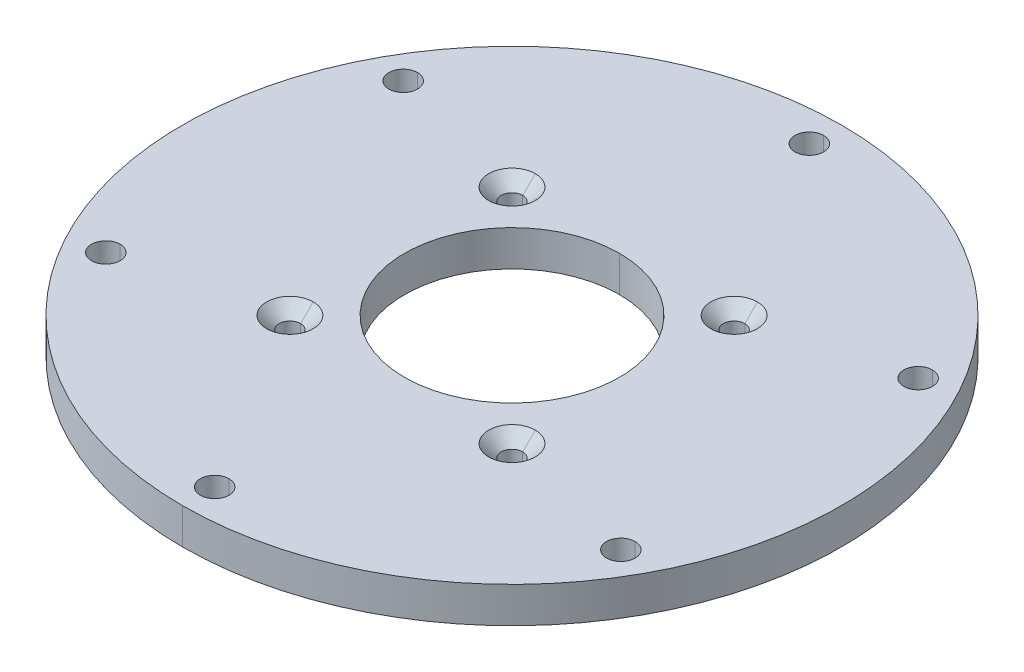
ISO-10303-21;
HEADER;
FILE_DESCRIPTION(('STEP AP214'),'2;1');
FILE_NAME('part.step','',(''),(''),'','','');
FILE_SCHEMA(('AUTOMOTIVE_DESIGN { 1 0 10303 214 1 1 1 1 }'));
ENDSEC;
DATA;
#1=APPLICATION_CONTEXT('core data for automotive mechanical design processes');
#2=APPLICATION_PROTOCOL_DEFINITION('international standard','automotive_design',2000,#1);
#3=PRODUCT_CONTEXT('',#1,'mechanical');
#4=PRODUCT('Part','Part','',(#3));
#5=PRODUCT_RELATED_PRODUCT_CATEGORY('part','',(#4));
#6=PRODUCT_DEFINITION_FORMATION('','',#4);
#7=PRODUCT_DEFINITION_CONTEXT('part definition',#1,'design');
#8=PRODUCT_DEFINITION('design','',#6,#7);
#9=PRODUCT_DEFINITION_SHAPE('','',#8);
#10=(LENGTH_UNIT() NAMED_UNIT(*) SI_UNIT(.MILLI.,.METRE.));
#11=(NAMED_UNIT(*) PLANE_ANGLE_UNIT() SI_UNIT($,.RADIAN.));
#12=(NAMED_UNIT(*) SI_UNIT($,.STERADIAN.) SOLID_ANGLE_UNIT());
#13=UNCERTAINTY_MEASURE_WITH_UNIT(LENGTH_MEASURE(1.E-05),#10,'distance_accuracy_value','');
#14=(GEOMETRIC_REPRESENTATION_CONTEXT(3) GLOBAL_UNCERTAINTY_ASSIGNED_CONTEXT((#13)) GLOBAL_UNIT_ASSIGNED_CONTEXT((#10,
#11,#12)) REPRESENTATION_CONTEXT('',''));
#15=CARTESIAN_POINT('',(0.,0.,0.));
#16=DIRECTION('',(0.,0.,1.));
#17=DIRECTION('',(1.,0.,0.));
#18=AXIS2_PLACEMENT_3D('',#15,#16,#17);
#19=CARTESIAN_POINT('',(15.5,5.,-15.5));
#20=DIRECTION('',(0.,1.,0.));
#21=DIRECTION('',(0.,0.,1.));
#22=AXIS2_PLACEMENT_3D('',#19,#20,#21);
#23=CONICAL_SURFACE('',#22,3.25,0.785398163397448);
#24=DIRECTION('',(0.,0.707106781186548,-0.707106781186548));
#25=VECTOR('',#24,1.);
#26=CARTESIAN_POINT('',(15.5,5.,-18.75));
#27=LINE('',#26,#25);
#28=CARTESIAN_POINT('',(15.5,3.25,-17.));
#29=VERTEX_POINT('',#28);
#30=CARTESIAN_POINT('',(15.5,5.,-18.75));
#31=VERTEX_POINT('',#30);
#32=EDGE_CURVE('E390',#29,#31,#27,.T.);
#33=ORIENTED_EDGE('',*,*,#32,.F.);
#34=CARTESIAN_POINT('',(15.5,3.25,-15.5));
#35=DIRECTION('',(0.,-1.,0.));
#36=DIRECTION('',(0.,0.,1.));
#37=AXIS2_PLACEMENT_3D('',#34,#35,#36);
#38=CIRCLE('',#37,1.5);
#39=CARTESIAN_POINT('',(15.5,3.25,-14.));
#40=VERTEX_POINT('',#39);
#41=EDGE_CURVE('E79',#29,#40,#38,.T.);
#42=ORIENTED_EDGE('',*,*,#41,.T.);
#43=DIRECTION('',(0.,0.707106781186548,0.707106781186548));
#44=VECTOR('',#43,1.);
#45=CARTESIAN_POINT('',(15.5,5.,-12.25));
#46=LINE('',#45,#44);
#47=CARTESIAN_POINT('',(15.5,5.,-12.25));
#48=VERTEX_POINT('',#47);
#49=EDGE_CURVE('E400',#40,#48,#46,.T.);
#50=ORIENTED_EDGE('',*,*,#49,.T.);
#51=CARTESIAN_POINT('',(15.5,5.,-15.5));
#52=DIRECTION('',(0.,1.,0.));
#53=DIRECTION('',(0.,0.,1.));
#54=AXIS2_PLACEMENT_3D('',#51,#52,#53);
#55=CIRCLE('',#54,3.25);
#56=EDGE_CURVE('E134',#48,#31,#55,.T.);
#57=ORIENTED_EDGE('',*,*,#56,.T.);
#58=EDGE_LOOP('',(#33,#42,#50,#57));
#59=FACE_BOUND('',#58,.T.);
#60=ADVANCED_FACE('F17',(#59),#23,.F.);
#61=CARTESIAN_POINT('',(15.5,5.,15.5));
#62=DIRECTION('',(0.,1.,0.));
#63=DIRECTION('',(0.,0.,1.));
#64=AXIS2_PLACEMENT_3D('',#61,#62,#63);
#65=CONICAL_SURFACE('',#64,3.25,0.785398163397448);
#66=DIRECTION('',(0.,0.707106781186548,-0.707106781186548));
#67=VECTOR('',#66,1.);
#68=CARTESIAN_POINT('',(15.5,5.,12.25));
#69=LINE('',#68,#67);
#70=CARTESIAN_POINT('',(15.5,3.25,14.));
#71=VERTEX_POINT('',#70);
#72=CARTESIAN_POINT('',(15.5,5.,12.25));
#73=VERTEX_POINT('',#72);
#74=EDGE_CURVE('E394',#71,#73,#69,.T.);
#75=ORIENTED_EDGE('',*,*,#74,.F.);
#76=CARTESIAN_POINT('',(15.5,3.25,15.5));
#77=DIRECTION('',(0.,-1.,0.));
#78=DIRECTION('',(0.,0.,1.));
#79=AXIS2_PLACEMENT_3D('',#76,#77,#78);
#80=CIRCLE('',#79,1.5);
#81=CARTESIAN_POINT('',(15.5,3.25,17.));
#82=VERTEX_POINT('',#81);
#83=EDGE_CURVE('E78',#71,#82,#80,.T.);
#84=ORIENTED_EDGE('',*,*,#83,.T.);
#85=DIRECTION('',(0.,0.707106781186548,0.707106781186548));
#86=VECTOR('',#85,1.);
#87=CARTESIAN_POINT('',(15.5,5.,18.75));
#88=LINE('',#87,#86);
#89=CARTESIAN_POINT('',(15.5,5.,18.75));
#90=VERTEX_POINT('',#89);
#91=EDGE_CURVE('E392',#82,#90,#88,.T.);
#92=ORIENTED_EDGE('',*,*,#91,.T.);
#93=CARTESIAN_POINT('',(15.5,5.,15.5));
#94=DIRECTION('',(0.,1.,0.));
#95=DIRECTION('',(0.,0.,1.));
#96=AXIS2_PLACEMENT_3D('',#93,#94,#95);
#97=CIRCLE('',#96,3.25);
#98=EDGE_CURVE('E129',#90,#73,#97,.T.);
#99=ORIENTED_EDGE('',*,*,#98,.T.);
#100=EDGE_LOOP('',(#75,#84,#92,#99));
#101=FACE_BOUND('',#100,.T.);
#102=ADVANCED_FACE('F651',(#101),#65,.F.);
#103=CARTESIAN_POINT('',(-15.5,5.,15.5));
#104=DIRECTION('',(0.,1.,0.));
#105=DIRECTION('',(0.,0.,1.));
#106=AXIS2_PLACEMENT_3D('',#103,#104,#105);
#107=CONICAL_SURFACE('',#106,3.25,0.785398163397448);
#108=DIRECTION('',(0.,0.707106781186548,-0.707106781186548));
#109=VECTOR('',#108,1.);
#110=CARTESIAN_POINT('',(-15.5,5.,12.25));
#111=LINE('',#110,#109);
#112=CARTESIAN_POINT('',(-15.5,3.25,14.));
#113=VERTEX_POINT('',#112);
#114=CARTESIAN_POINT('',(-15.5,5.,12.25));
#115=VERTEX_POINT('',#114);
#116=EDGE_CURVE('E435',#113,#115,#111,.T.);
#117=ORIENTED_EDGE('',*,*,#116,.F.);
#118=CARTESIAN_POINT('',(-15.5,3.25,15.5));
#119=DIRECTION('',(0.,-1.,0.));
#120=DIRECTION('',(0.,0.,1.));
#121=AXIS2_PLACEMENT_3D('',#118,#119,#120);
#122=CIRCLE('',#121,1.5);
#123=CARTESIAN_POINT('',(-15.5,3.25,17.));
#124=VERTEX_POINT('',#123);
#125=EDGE_CURVE('E122',#113,#124,#122,.T.);
#126=ORIENTED_EDGE('',*,*,#125,.T.);
#127=DIRECTION('',(0.,0.707106781186548,0.707106781186548));
#128=VECTOR('',#127,1.);
#129=CARTESIAN_POINT('',(-15.5,5.,18.75));
#130=LINE('',#129,#128);
#131=CARTESIAN_POINT('',(-15.5,5.,18.75));
#132=VERTEX_POINT('',#131);
#133=EDGE_CURVE('E422',#124,#132,#130,.T.);
#134=ORIENTED_EDGE('',*,*,#133,.T.);
#135=CARTESIAN_POINT('',(-15.5,5.,15.5));
#136=DIRECTION('',(0.,1.,0.));
#137=DIRECTION('',(0.,0.,1.));
#138=AXIS2_PLACEMENT_3D('',#135,#136,#137);
#139=CIRCLE('',#138,3.25);
#140=EDGE_CURVE('E133',#132,#115,#139,.T.);
#141=ORIENTED_EDGE('',*,*,#140,.T.);
#142=EDGE_LOOP('',(#117,#126,#134,#141));
#143=FACE_BOUND('',#142,.T.);
#144=ADVANCED_FACE('F623',(#143),#107,.F.);
#145=CARTESIAN_POINT('',(-15.5,5.,-15.5));
#146=DIRECTION('',(0.,1.,0.));
#147=DIRECTION('',(0.,0.,1.));
#148=AXIS2_PLACEMENT_3D('',#145,#146,#147);
#149=CONICAL_SURFACE('',#148,3.25,0.785398163397448);
#150=DIRECTION('',(0.,0.707106781186548,-0.707106781186548));
#151=VECTOR('',#150,1.);
#152=CARTESIAN_POINT('',(-15.5,5.,-18.75));
#153=LINE('',#152,#151);
#154=CARTESIAN_POINT('',(-15.5,3.25,-17.));
#155=VERTEX_POINT('',#154);
#156=CARTESIAN_POINT('',(-15.5,5.,-18.75));
#157=VERTEX_POINT('',#156);
#158=EDGE_CURVE('E403',#155,#157,#153,.T.);
#159=ORIENTED_EDGE('',*,*,#158,.F.);
#160=CARTESIAN_POINT('',(-15.5,3.25,-15.5));
#161=DIRECTION('',(0.,-1.,0.));
#162=DIRECTION('',(0.,0.,1.));
#163=AXIS2_PLACEMENT_3D('',#160,#161,#162);
#164=CIRCLE('',#163,1.5);
#165=CARTESIAN_POINT('',(-15.5,3.25,-14.));
#166=VERTEX_POINT('',#165);
#167=EDGE_CURVE('E112',#155,#166,#164,.T.);
#168=ORIENTED_EDGE('',*,*,#167,.T.);
#169=DIRECTION('',(0.,0.707106781186548,0.707106781186548));
#170=VECTOR('',#169,1.);
#171=CARTESIAN_POINT('',(-15.5,5.,-12.25));
#172=LINE('',#171,#170);
#173=CARTESIAN_POINT('',(-15.5,5.,-12.25));
#174=VERTEX_POINT('',#173);
#175=EDGE_CURVE('E417',#166,#174,#172,.T.);
#176=ORIENTED_EDGE('',*,*,#175,.T.);
#177=CARTESIAN_POINT('',(-15.5,5.,-15.5));
#178=DIRECTION('',(0.,1.,0.));
#179=DIRECTION('',(0.,0.,1.));
#180=AXIS2_PLACEMENT_3D('',#177,#178,#179);
#181=CIRCLE('',#180,3.25);
#182=EDGE_CURVE('E143',#174,#157,#181,.T.);
#183=ORIENTED_EDGE('',*,*,#182,.T.);
#184=EDGE_LOOP('',(#159,#168,#176,#183));
#185=FACE_BOUND('',#184,.T.);
#186=ADVANCED_FACE('F1041',(#185),#149,.F.);
#187=CARTESIAN_POINT('',(0.,5.,0.));
#188=DIRECTION('',(0.,-1.,0.));
#189=DIRECTION('',(0.,0.,-1.));
#190=AXIS2_PLACEMENT_3D('',#187,#188,#189);
#191=CYLINDRICAL_SURFACE('',#190,15.);
#192=DIRECTION('',(0.,-1.,0.));
#193=VECTOR('',#192,1.);
#194=CARTESIAN_POINT('',(0.,5.,15.));
#195=LINE('',#194,#193);
#196=CARTESIAN_POINT('',(0.,5.,15.));
#197=VERTEX_POINT('',#196);
#198=CARTESIAN_POINT('',(0.,0.,15.));
#199=VERTEX_POINT('',#198);
#200=EDGE_CURVE('E454',#197,#199,#195,.T.);
#201=ORIENTED_EDGE('',*,*,#200,.F.);
#202=CARTESIAN_POINT('',(0.,5.,0.));
#203=DIRECTION('',(0.,-1.,0.));
#204=DIRECTION('',(0.,0.,-1.));
#205=AXIS2_PLACEMENT_3D('',#202,#203,#204);
#206=CIRCLE('',#205,15.);
#207=CARTESIAN_POINT('',(0.,5.,-15.));
#208=VERTEX_POINT('',#207);
#209=EDGE_CURVE('E137',#208,#197,#206,.T.);
#210=ORIENTED_EDGE('',*,*,#209,.F.);
#211=DIRECTION('',(0.,-1.,0.));
#212=VECTOR('',#211,1.);
#213=CARTESIAN_POINT('',(0.,5.,-15.));
#214=LINE('',#213,#212);
#215=CARTESIAN_POINT('',(0.,0.,-15.));
#216=VERTEX_POINT('',#215);
#217=EDGE_CURVE('E292',#208,#216,#214,.T.);
#218=ORIENTED_EDGE('',*,*,#217,.T.);
#219=CARTESIAN_POINT('',(0.,0.,0.));
#220=DIRECTION('',(0.,-1.,0.));
#221=DIRECTION('',(0.,0.,-1.));
#222=AXIS2_PLACEMENT_3D('',#219,#220,#221);
#223=CIRCLE('',#222,15.);
#224=EDGE_CURVE('E157',#216,#199,#223,.T.);
#225=ORIENTED_EDGE('',*,*,#224,.T.);
#226=EDGE_LOOP('',(#201,#210,#218,#225));
#227=FACE_BOUND('',#226,.T.);
#228=ADVANCED_FACE('F466',(#227),#191,.F.);
#229=CARTESIAN_POINT('',(0.,5.,41.5));
#230=DIRECTION('',(0.,-1.,0.));
#231=DIRECTION('',(0.,0.,-1.));
#232=AXIS2_PLACEMENT_3D('',#229,#230,#231);
#233=CYLINDRICAL_SURFACE('',#232,2.);
#234=DIRECTION('',(0.,-1.,0.));
#235=VECTOR('',#234,1.);
#236=CARTESIAN_POINT('',(0.,5.,43.5));
#237=LINE('',#236,#235);
#238=CARTESIAN_POINT('',(0.,5.,43.5));
#239=VERTEX_POINT('',#238);
#240=CARTESIAN_POINT('',(0.,0.,43.5));
#241=VERTEX_POINT('',#240);
#242=EDGE_CURVE('E298',#239,#241,#237,.T.);
#243=ORIENTED_EDGE('',*,*,#242,.F.);
#244=CARTESIAN_POINT('',(0.,5.,41.5));
#245=DIRECTION('',(0.,-1.,0.));
#246=DIRECTION('',(0.,0.,-1.));
#247=AXIS2_PLACEMENT_3D('',#244,#245,#246);
#248=CIRCLE('',#247,2.);
#249=CARTESIAN_POINT('',(0.,5.,39.5));
#250=VERTEX_POINT('',#249);
#251=EDGE_CURVE('E138',#250,#239,#248,.T.);
#252=ORIENTED_EDGE('',*,*,#251,.F.);
#253=DIRECTION('',(0.,-1.,0.));
#254=VECTOR('',#253,1.);
#255=CARTESIAN_POINT('',(0.,5.,39.5));
#256=LINE('',#255,#254);
#257=CARTESIAN_POINT('',(0.,0.,39.5));
#258=VERTEX_POINT('',#257);
#259=EDGE_CURVE('E311',#250,#258,#256,.T.);
#260=ORIENTED_EDGE('',*,*,#259,.T.);
#261=CARTESIAN_POINT('',(0.,0.,41.5));
#262=DIRECTION('',(0.,-1.,0.));
#263=DIRECTION('',(0.,0.,-1.));
#264=AXIS2_PLACEMENT_3D('',#261,#262,#263);
#265=CIRCLE('',#264,2.);
#266=EDGE_CURVE('E162',#258,#241,#265,.T.);
#267=ORIENTED_EDGE('',*,*,#266,.T.);
#268=EDGE_LOOP('',(#243,#252,#260,#267));
#269=FACE_BOUND('',#268,.T.);
#270=ADVANCED_FACE('F1163',(#269),#233,.F.);
#271=CARTESIAN_POINT('',(-35.9400542570542,5.,20.75));
#272=DIRECTION('',(0.,-1.,0.));
#273=DIRECTION('',(0.,0.,-1.));
#274=AXIS2_PLACEMENT_3D('',#271,#272,#273);
#275=CYLINDRICAL_SURFACE('',#274,2.);
#276=DIRECTION('',(0.,-1.,0.));
#277=VECTOR('',#276,1.);
#278=CARTESIAN_POINT('',(-35.9400542570542,5.,22.75));
#279=LINE('',#278,#277);
#280=CARTESIAN_POINT('',(-35.9400542570542,5.,22.75));
#281=VERTEX_POINT('',#280);
#282=CARTESIAN_POINT('',(-35.9400542570542,0.,22.75));
#283=VERTEX_POINT('',#282);
#284=EDGE_CURVE('E328',#281,#283,#279,.T.);
#285=ORIENTED_EDGE('',*,*,#284,.F.);
#286=CARTESIAN_POINT('',(-35.9400542570542,5.,20.75));
#287=DIRECTION('',(0.,-1.,0.));
#288=DIRECTION('',(0.,0.,-1.));
#289=AXIS2_PLACEMENT_3D('',#286,#287,#288);
#290=CIRCLE('',#289,2.);
#291=CARTESIAN_POINT('',(-35.9400542570542,5.,18.75));
#292=VERTEX_POINT('',#291);
#293=EDGE_CURVE('E144',#292,#281,#290,.T.);
#294=ORIENTED_EDGE('',*,*,#293,.F.);
#295=DIRECTION('',(0.,-1.,0.));
#296=VECTOR('',#295,1.);
#297=CARTESIAN_POINT('',(-35.9400542570542,5.,18.75));
#298=LINE('',#297,#296);
#299=CARTESIAN_POINT('',(-35.9400542570542,0.,18.75));
#300=VERTEX_POINT('',#299);
#301=EDGE_CURVE('E340',#292,#300,#298,.T.);
#302=ORIENTED_EDGE('',*,*,#301,.T.);
#303=CARTESIAN_POINT('',(-35.9400542570542,0.,20.75));
#304=DIRECTION('',(0.,-1.,0.));
#305=DIRECTION('',(0.,0.,-1.));
#306=AXIS2_PLACEMENT_3D('',#303,#304,#305);
#307=CIRCLE('',#306,2.);
#308=EDGE_CURVE('E170',#300,#283,#307,.T.);
#309=ORIENTED_EDGE('',*,*,#308,.T.);
#310=EDGE_LOOP('',(#285,#294,#302,#309));
#311=FACE_BOUND('',#310,.T.);
#312=ADVANCED_FACE('F1154',(#311),#275,.F.);
#313=CARTESIAN_POINT('',(-35.9400542570542,5.,-20.75));
#314=DIRECTION('',(0.,-1.,0.));
#315=DIRECTION('',(0.,0.,-1.));
#316=AXIS2_PLACEMENT_3D('',#313,#314,#315);
#317=CYLINDRICAL_SURFACE('',#316,2.);
#318=DIRECTION('',(0.,-1.,0.));
#319=VECTOR('',#318,1.);
#320=CARTESIAN_POINT('',(-35.9400542570542,5.,-18.75));
#321=LINE('',#320,#319);
#322=CARTESIAN_POINT('',(-35.9400542570542,5.,-18.75));
#323=VERTEX_POINT('',#322);
#324=CARTESIAN_POINT('',(-35.9400542570542,0.,-18.75));
#325=VERTEX_POINT('',#324);
#326=EDGE_CURVE('E303',#323,#325,#321,.T.);
#327=ORIENTED_EDGE('',*,*,#326,.F.);
#328=CARTESIAN_POINT('',(-35.9400542570542,5.,-20.75));
#329=DIRECTION('',(0.,-1.,0.));
#330=DIRECTION('',(0.,0.,-1.));
#331=AXIS2_PLACEMENT_3D('',#328,#329,#330);
#332=CIRCLE('',#331,2.);
#333=CARTESIAN_POINT('',(-35.9400542570542,5.,-22.75));
#334=VERTEX_POINT('',#333);
#335=EDGE_CURVE('E149',#334,#323,#332,.T.);
#336=ORIENTED_EDGE('',*,*,#335,.F.);
#337=DIRECTION('',(0.,-1.,0.));
#338=VECTOR('',#337,1.);
#339=CARTESIAN_POINT('',(-35.9400542570542,5.,-22.75));
#340=LINE('',#339,#338);
#341=CARTESIAN_POINT('',(-35.9400542570542,0.,-22.75));
#342=VERTEX_POINT('',#341);
#343=EDGE_CURVE('E301',#334,#342,#340,.T.);
#344=ORIENTED_EDGE('',*,*,#343,.T.);
#345=CARTESIAN_POINT('',(-35.9400542570542,0.,-20.75));
#346=DIRECTION('',(0.,-1.,0.));
#347=DIRECTION('',(0.,0.,-1.));
#348=AXIS2_PLACEMENT_3D('',#345,#346,#347);
#349=CIRCLE('',#348,2.);
#350=EDGE_CURVE('E171',#342,#325,#349,.T.);
#351=ORIENTED_EDGE('',*,*,#350,.T.);
#352=EDGE_LOOP('',(#327,#336,#344,#351));
#353=FACE_BOUND('',#352,.T.);
#354=ADVANCED_FACE('F1150',(#353),#317,.F.);
#355=CARTESIAN_POINT('',(0.,5.,-41.5));
#356=DIRECTION('',(0.,-1.,0.));
#357=DIRECTION('',(0.,0.,-1.));
#358=AXIS2_PLACEMENT_3D('',#355,#356,#357);
#359=CYLINDRICAL_SURFACE('',#358,2.);
#360=DIRECTION('',(0.,-1.,0.));
#361=VECTOR('',#360,1.);
#362=CARTESIAN_POINT('',(0.,5.,-39.5));
#363=LINE('',#362,#361);
#364=CARTESIAN_POINT('',(0.,5.,-39.5));
#365=VERTEX_POINT('',#364);
#366=CARTESIAN_POINT('',(0.,0.,-39.5));
#367=VERTEX_POINT('',#366);
#368=EDGE_CURVE('E359',#365,#367,#363,.T.);
#369=ORIENTED_EDGE('',*,*,#368,.F.);
#370=CARTESIAN_POINT('',(0.,5.,-41.5));
#371=DIRECTION('',(0.,-1.,0.));
#372=DIRECTION('',(0.,0.,-1.));
#373=AXIS2_PLACEMENT_3D('',#370,#371,#372);
#374=CIRCLE('',#373,2.);
#375=CARTESIAN_POINT('',(0.,5.,-43.5));
#376=VERTEX_POINT('',#375);
#377=EDGE_CURVE('E154',#376,#365,#374,.T.);
#378=ORIENTED_EDGE('',*,*,#377,.F.);
#379=DIRECTION('',(0.,-1.,0.));
#380=VECTOR('',#379,1.);
#381=CARTESIAN_POINT('',(0.,5.,-43.5));
#382=LINE('',#381,#380);
#383=CARTESIAN_POINT('',(0.,0.,-43.5));
#384=VERTEX_POINT('',#383);
#385=EDGE_CURVE('E214',#376,#384,#382,.T.);
#386=ORIENTED_EDGE('',*,*,#385,.T.);
#387=CARTESIAN_POINT('',(0.,0.,-41.5));
#388=DIRECTION('',(0.,-1.,0.));
#389=DIRECTION('',(0.,0.,-1.));
#390=AXIS2_PLACEMENT_3D('',#387,#388,#389);
#391=CIRCLE('',#390,2.);
#392=EDGE_CURVE('E175',#384,#367,#391,.T.);
#393=ORIENTED_EDGE('',*,*,#392,.T.);
#394=EDGE_LOOP('',(#369,#378,#386,#393));
#395=FACE_BOUND('',#394,.T.);
#396=ADVANCED_FACE('F1139',(#395),#359,.F.);
#397=CARTESIAN_POINT('',(35.9400542570542,5.,-20.75));
#398=DIRECTION('',(0.,-1.,0.));
#399=DIRECTION('',(0.,0.,-1.));
#400=AXIS2_PLACEMENT_3D('',#397,#398,#399);
#401=CYLINDRICAL_SURFACE('',#400,2.);
#402=DIRECTION('',(0.,-1.,0.));
#403=VECTOR('',#402,1.);
#404=CARTESIAN_POINT('',(35.9400542570542,5.,-18.75));
#405=LINE('',#404,#403);
#406=CARTESIAN_POINT('',(35.9400542570542,5.,-18.75));
#407=VERTEX_POINT('',#406);
#408=CARTESIAN_POINT('',(35.9400542570542,0.,-18.75));
#409=VERTEX_POINT('',#408);
#410=EDGE_CURVE('E195',#407,#409,#405,.T.);
#411=ORIENTED_EDGE('',*,*,#410,.F.);
#412=CARTESIAN_POINT('',(35.9400542570542,5.,-20.75));
#413=DIRECTION('',(0.,-1.,0.));
#414=DIRECTION('',(0.,0.,-1.));
#415=AXIS2_PLACEMENT_3D('',#412,#413,#414);
#416=CIRCLE('',#415,2.);
#417=CARTESIAN_POINT('',(35.9400542570542,5.,-22.75));
#418=VERTEX_POINT('',#417);
#419=EDGE_CURVE('E147',#418,#407,#416,.T.);
#420=ORIENTED_EDGE('',*,*,#419,.F.);
#421=DIRECTION('',(0.,-1.,0.));
#422=VECTOR('',#421,1.);
#423=CARTESIAN_POINT('',(35.9400542570542,5.,-22.75));
#424=LINE('',#423,#422);
#425=CARTESIAN_POINT('',(35.9400542570542,0.,-22.75));
#426=VERTEX_POINT('',#425);
#427=EDGE_CURVE('E198',#418,#426,#424,.T.);
#428=ORIENTED_EDGE('',*,*,#427,.T.);
#429=CARTESIAN_POINT('',(35.9400542570542,0.,-20.75));
#430=DIRECTION('',(0.,-1.,0.));
#431=DIRECTION('',(0.,0.,-1.));
#432=AXIS2_PLACEMENT_3D('',#429,#430,#431);
#433=CIRCLE('',#432,2.);
#434=EDGE_CURVE('E27',#426,#409,#433,.T.);
#435=ORIENTED_EDGE('',*,*,#434,.T.);
#436=EDGE_LOOP('',(#411,#420,#428,#435));
#437=FACE_BOUND('',#436,.T.);
#438=ADVANCED_FACE('F187',(#437),#401,.F.);
#439=CARTESIAN_POINT('',(35.9400542570542,5.,20.75));
#440=DIRECTION('',(0.,-1.,0.));
#441=DIRECTION('',(0.,0.,-1.));
#442=AXIS2_PLACEMENT_3D('',#439,#440,#441);
#443=CYLINDRICAL_SURFACE('',#442,2.);
#444=DIRECTION('',(0.,-1.,0.));
#445=VECTOR('',#444,1.);
#446=CARTESIAN_POINT('',(35.9400542570542,5.,22.75));
#447=LINE('',#446,#445);
#448=CARTESIAN_POINT('',(35.9400542570542,5.,22.75));
#449=VERTEX_POINT('',#448);
#450=CARTESIAN_POINT('',(35.9400542570542,0.,22.75));
#451=VERTEX_POINT('',#450);
#452=EDGE_CURVE('E223',#449,#451,#447,.T.);
#453=ORIENTED_EDGE('',*,*,#452,.F.);
#454=CARTESIAN_POINT('',(35.9400542570542,5.,20.75));
#455=DIRECTION('',(0.,-1.,0.));
#456=DIRECTION('',(0.,0.,-1.));
#457=AXIS2_PLACEMENT_3D('',#454,#455,#456);
#458=CIRCLE('',#457,2.);
#459=CARTESIAN_POINT('',(35.9400542570542,5.,18.75));
#460=VERTEX_POINT('',#459);
#461=EDGE_CURVE('E152',#460,#449,#458,.T.);
#462=ORIENTED_EDGE('',*,*,#461,.F.);
#463=DIRECTION('',(0.,-1.,0.));
#464=VECTOR('',#463,1.);
#465=CARTESIAN_POINT('',(35.9400542570542,5.,18.75));
#466=LINE('',#465,#464);
#467=CARTESIAN_POINT('',(35.9400542570542,0.,18.75));
#468=VERTEX_POINT('',#467);
#469=EDGE_CURVE('E230',#460,#468,#466,.T.);
#470=ORIENTED_EDGE('',*,*,#469,.T.);
#471=CARTESIAN_POINT('',(35.9400542570542,0.,20.75));
#472=DIRECTION('',(0.,-1.,0.));
#473=DIRECTION('',(0.,0.,-1.));
#474=AXIS2_PLACEMENT_3D('',#471,#472,#473);
#475=CIRCLE('',#474,2.);
#476=EDGE_CURVE('E11',#468,#451,#475,.T.);
#477=ORIENTED_EDGE('',*,*,#476,.T.);
#478=EDGE_LOOP('',(#453,#462,#470,#477));
#479=FACE_BOUND('',#478,.T.);
#480=ADVANCED_FACE('F664',(#479),#443,.F.);
#481=CARTESIAN_POINT('',(0.,0.,0.));
#482=DIRECTION('',(0.,1.,0.));
#483=DIRECTION('',(1.,0.,0.));
#484=AXIS2_PLACEMENT_3D('',#481,#482,#483);
#485=PLANE('',#484);
#486=CARTESIAN_POINT('',(-15.5,0.,-15.5));
#487=DIRECTION('',(0.,1.,0.));
#488=DIRECTION('',(0.,0.,1.));
#489=AXIS2_PLACEMENT_3D('',#486,#487,#488);
#490=CIRCLE('',#489,1.5);
#491=CARTESIAN_POINT('',(-15.5,0.,-17.));
#492=VERTEX_POINT('',#491);
#493=CARTESIAN_POINT('',(-15.5,0.,-14.));
#494=VERTEX_POINT('',#493);
#495=EDGE_CURVE('E106',#492,#494,#490,.T.);
#496=ORIENTED_EDGE('',*,*,#495,.T.);
#497=CARTESIAN_POINT('',(-15.5,0.,-15.5));
#498=DIRECTION('',(0.,1.,0.));
#499=DIRECTION('',(0.,0.,1.));
#500=AXIS2_PLACEMENT_3D('',#497,#498,#499);
#501=CIRCLE('',#500,1.5);
#502=EDGE_CURVE('E39',#494,#492,#501,.T.);
#503=ORIENTED_EDGE('',*,*,#502,.T.);
#504=EDGE_LOOP('',(#496,#503));
#505=FACE_BOUND('',#504,.T.);
#506=CARTESIAN_POINT('',(15.5,0.,-15.5));
#507=DIRECTION('',(0.,1.,0.));
#508=DIRECTION('',(0.,0.,1.));
#509=AXIS2_PLACEMENT_3D('',#506,#507,#508);
#510=CIRCLE('',#509,1.5);
#511=CARTESIAN_POINT('',(15.5,0.,-17.));
#512=VERTEX_POINT('',#511);
#513=CARTESIAN_POINT('',(15.5,0.,-14.));
#514=VERTEX_POINT('',#513);
#515=EDGE_CURVE('E76',#512,#514,#510,.T.);
#516=ORIENTED_EDGE('',*,*,#515,.T.);
#517=CARTESIAN_POINT('',(15.5,0.,-15.5));
#518=DIRECTION('',(0.,1.,0.));
#519=DIRECTION('',(0.,0.,1.));
#520=AXIS2_PLACEMENT_3D('',#517,#518,#519);
#521=CIRCLE('',#520,1.5);
#522=EDGE_CURVE('E66',#514,#512,#521,.T.);
#523=ORIENTED_EDGE('',*,*,#522,.T.);
#524=EDGE_LOOP('',(#516,#523));
#525=FACE_BOUND('',#524,.T.);
#526=CARTESIAN_POINT('',(15.5,0.,15.5));
#527=DIRECTION('',(0.,1.,0.));
#528=DIRECTION('',(0.,0.,1.));
#529=AXIS2_PLACEMENT_3D('',#526,#527,#528);
#530=CIRCLE('',#529,1.5);
#531=CARTESIAN_POINT('',(15.5,0.,14.));
#532=VERTEX_POINT('',#531);
#533=CARTESIAN_POINT('',(15.5,0.,17.));
#534=VERTEX_POINT('',#533);
#535=EDGE_CURVE('E266',#532,#534,#530,.T.);
#536=ORIENTED_EDGE('',*,*,#535,.T.);
#537=CARTESIAN_POINT('',(15.5,0.,15.5));
#538=DIRECTION('',(0.,1.,0.));
#539=DIRECTION('',(0.,0.,1.));
#540=AXIS2_PLACEMENT_3D('',#537,#538,#539);
#541=CIRCLE('',#540,1.5);
#542=EDGE_CURVE('E121',#534,#532,#541,.T.);
#543=ORIENTED_EDGE('',*,*,#542,.T.);
#544=EDGE_LOOP('',(#536,#543));
#545=FACE_BOUND('',#544,.T.);
#546=CARTESIAN_POINT('',(-15.5,0.,15.5));
#547=DIRECTION('',(0.,1.,0.));
#548=DIRECTION('',(0.,0.,1.));
#549=AXIS2_PLACEMENT_3D('',#546,#547,#548);
#550=CIRCLE('',#549,1.5);
#551=CARTESIAN_POINT('',(-15.5,0.,14.));
#552=VERTEX_POINT('',#551);
#553=CARTESIAN_POINT('',(-15.5,0.,17.));
#554=VERTEX_POINT('',#553);
#555=EDGE_CURVE('E255',#552,#554,#550,.T.);
#556=ORIENTED_EDGE('',*,*,#555,.T.);
#557=CARTESIAN_POINT('',(-15.5,0.,15.5));
#558=DIRECTION('',(0.,1.,0.));
#559=DIRECTION('',(0.,0.,1.));
#560=AXIS2_PLACEMENT_3D('',#557,#558,#559);
#561=CIRCLE('',#560,1.5);
#562=EDGE_CURVE('E127',#554,#552,#561,.T.);
#563=ORIENTED_EDGE('',*,*,#562,.T.);
#564=EDGE_LOOP('',(#556,#563));
#565=FACE_BOUND('',#564,.T.);
#566=ORIENTED_EDGE('',*,*,#476,.F.);
#567=CARTESIAN_POINT('',(35.9400542570542,0.,20.75));
#568=DIRECTION('',(0.,-1.,0.));
#569=DIRECTION('',(0.,0.,-1.));
#570=AXIS2_PLACEMENT_3D('',#567,#568,#569);
#571=CIRCLE('',#570,2.);
#572=EDGE_CURVE('E228',#451,#468,#571,.T.);
#573=ORIENTED_EDGE('',*,*,#572,.F.);
#574=EDGE_LOOP('',(#566,#573));
#575=FACE_BOUND('',#574,.T.);
#576=ORIENTED_EDGE('',*,*,#434,.F.);
#577=CARTESIAN_POINT('',(35.9400542570542,0.,-20.75));
#578=DIRECTION('',(0.,-1.,0.));
#579=DIRECTION('',(0.,0.,-1.));
#580=AXIS2_PLACEMENT_3D('',#577,#578,#579);
#581=CIRCLE('',#580,2.);
#582=EDGE_CURVE('E205',#409,#426,#581,.T.);
#583=ORIENTED_EDGE('',*,*,#582,.F.);
#584=EDGE_LOOP('',(#576,#583));
#585=FACE_BOUND('',#584,.T.);
#586=ORIENTED_EDGE('',*,*,#392,.F.);
#587=CARTESIAN_POINT('',(0.,0.,-41.5));
#588=DIRECTION('',(0.,-1.,0.));
#589=DIRECTION('',(0.,0.,-1.));
#590=AXIS2_PLACEMENT_3D('',#587,#588,#589);
#591=CIRCLE('',#590,2.);
#592=EDGE_CURVE('E364',#367,#384,#591,.T.);
#593=ORIENTED_EDGE('',*,*,#592,.F.);
#594=EDGE_LOOP('',(#586,#593));
#595=FACE_BOUND('',#594,.T.);
#596=ORIENTED_EDGE('',*,*,#350,.F.);
#597=CARTESIAN_POINT('',(-35.9400542570542,0.,-20.75));
#598=DIRECTION('',(0.,-1.,0.));
#599=DIRECTION('',(0.,0.,-1.));
#600=AXIS2_PLACEMENT_3D('',#597,#598,#599);
#601=CIRCLE('',#600,2.);
#602=EDGE_CURVE('E299',#325,#342,#601,.T.);
#603=ORIENTED_EDGE('',*,*,#602,.F.);
#604=EDGE_LOOP('',(#596,#603));
#605=FACE_BOUND('',#604,.T.);
#606=ORIENTED_EDGE('',*,*,#308,.F.);
#607=CARTESIAN_POINT('',(-35.9400542570542,0.,20.75));
#608=DIRECTION('',(0.,-1.,0.));
#609=DIRECTION('',(0.,0.,-1.));
#610=AXIS2_PLACEMENT_3D('',#607,#608,#609);
#611=CIRCLE('',#610,2.);
#612=EDGE_CURVE('E334',#283,#300,#611,.T.);
#613=ORIENTED_EDGE('',*,*,#612,.F.);
#614=EDGE_LOOP('',(#606,#613));
#615=FACE_BOUND('',#614,.T.);
#616=ORIENTED_EDGE('',*,*,#266,.F.);
#617=CARTESIAN_POINT('',(0.,0.,41.5));
#618=DIRECTION('',(0.,-1.,0.));
#619=DIRECTION('',(0.,0.,-1.));
#620=AXIS2_PLACEMENT_3D('',#617,#618,#619);
#621=CIRCLE('',#620,2.);
#622=EDGE_CURVE('E310',#241,#258,#621,.T.);
#623=ORIENTED_EDGE('',*,*,#622,.F.);
#624=EDGE_LOOP('',(#616,#623));
#625=FACE_BOUND('',#624,.T.);
#626=ORIENTED_EDGE('',*,*,#224,.F.);
#627=CARTESIAN_POINT('',(0.,0.,0.));
#628=DIRECTION('',(0.,-1.,0.));
#629=DIRECTION('',(0.,0.,-1.));
#630=AXIS2_PLACEMENT_3D('',#627,#628,#629);
#631=CIRCLE('',#630,15.);
#632=EDGE_CURVE('E453',#199,#216,#631,.T.);
#633=ORIENTED_EDGE('',*,*,#632,.F.);
#634=EDGE_LOOP('',(#626,#633));
#635=FACE_BOUND('',#634,.T.);
#636=CARTESIAN_POINT('',(0.,0.,0.));
#637=DIRECTION('',(0.,1.,0.));
#638=DIRECTION('',(0.,0.,1.));
#639=AXIS2_PLACEMENT_3D('',#636,#637,#638);
#640=CIRCLE('',#639,46.);
#641=CARTESIAN_POINT('',(0.,0.,-46.));
#642=VERTEX_POINT('',#641);
#643=CARTESIAN_POINT('',(0.,0.,46.));
#644=VERTEX_POINT('',#643);
#645=EDGE_CURVE('E324',#642,#644,#640,.T.);
#646=ORIENTED_EDGE('',*,*,#645,.F.);
#647=CARTESIAN_POINT('',(0.,0.,0.));
#648=DIRECTION('',(0.,1.,0.));
#649=DIRECTION('',(0.,0.,1.));
#650=AXIS2_PLACEMENT_3D('',#647,#648,#649);
#651=CIRCLE('',#650,46.);
#652=EDGE_CURVE('E237',#644,#642,#651,.T.);
#653=ORIENTED_EDGE('',*,*,#652,.F.);
#654=EDGE_LOOP('',(#646,#653));
#655=FACE_BOUND('',#654,.T.);
#656=ADVANCED_FACE('F73',(#505,#525,#545,#565,#575,#585,#595,#605,#615,#625,#635,#655),#485,.F.);
#657=CARTESIAN_POINT('',(0.,5.,0.));
#658=DIRECTION('',(0.,1.,0.));
#659=DIRECTION('',(1.,0.,0.));
#660=AXIS2_PLACEMENT_3D('',#657,#658,#659);
#661=PLANE('',#660);
#662=ORIENTED_EDGE('',*,*,#461,.T.);
#663=CARTESIAN_POINT('',(35.9400542570542,5.,20.75));
#664=DIRECTION('',(0.,-1.,0.));
#665=DIRECTION('',(0.,0.,-1.));
#666=AXIS2_PLACEMENT_3D('',#663,#664,#665);
#667=CIRCLE('',#666,2.);
#668=EDGE_CURVE('E222',#449,#460,#667,.T.);
#669=ORIENTED_EDGE('',*,*,#668,.T.);
#670=EDGE_LOOP('',(#662,#669));
#671=FACE_BOUND('',#670,.T.);
#672=ORIENTED_EDGE('',*,*,#419,.T.);
#673=CARTESIAN_POINT('',(35.9400542570542,5.,-20.75));
#674=DIRECTION('',(0.,-1.,0.));
#675=DIRECTION('',(0.,0.,-1.));
#676=AXIS2_PLACEMENT_3D('',#673,#674,#675);
#677=CIRCLE('',#676,2.);
#678=EDGE_CURVE('E207',#407,#418,#677,.T.);
#679=ORIENTED_EDGE('',*,*,#678,.T.);
#680=EDGE_LOOP('',(#672,#679));
#681=FACE_BOUND('',#680,.T.);
#682=ORIENTED_EDGE('',*,*,#377,.T.);
#683=CARTESIAN_POINT('',(0.,5.,-41.5));
#684=DIRECTION('',(0.,-1.,0.));
#685=DIRECTION('',(0.,0.,-1.));
#686=AXIS2_PLACEMENT_3D('',#683,#684,#685);
#687=CIRCLE('',#686,2.);
#688=EDGE_CURVE('E353',#365,#376,#687,.T.);
#689=ORIENTED_EDGE('',*,*,#688,.T.);
#690=EDGE_LOOP('',(#682,#689));
#691=FACE_BOUND('',#690,.T.);
#692=ORIENTED_EDGE('',*,*,#335,.T.);
#693=CARTESIAN_POINT('',(-35.9400542570542,5.,-20.75));
#694=DIRECTION('',(0.,-1.,0.));
#695=DIRECTION('',(0.,0.,-1.));
#696=AXIS2_PLACEMENT_3D('',#693,#694,#695);
#697=CIRCLE('',#696,2.);
#698=EDGE_CURVE('E345',#323,#334,#697,.T.);
#699=ORIENTED_EDGE('',*,*,#698,.T.);
#700=EDGE_LOOP('',(#692,#699));
#701=FACE_BOUND('',#700,.T.);
#702=ORIENTED_EDGE('',*,*,#293,.T.);
#703=CARTESIAN_POINT('',(-35.9400542570542,5.,20.75));
#704=DIRECTION('',(0.,-1.,0.));
#705=DIRECTION('',(0.,0.,-1.));
#706=AXIS2_PLACEMENT_3D('',#703,#704,#705);
#707=CIRCLE('',#706,2.);
#708=EDGE_CURVE('E319',#281,#292,#707,.T.);
#709=ORIENTED_EDGE('',*,*,#708,.T.);
#710=EDGE_LOOP('',(#702,#709));
#711=FACE_BOUND('',#710,.T.);
#712=ORIENTED_EDGE('',*,*,#251,.T.);
#713=CARTESIAN_POINT('',(0.,5.,41.5));
#714=DIRECTION('',(0.,-1.,0.));
#715=DIRECTION('',(0.,0.,-1.));
#716=AXIS2_PLACEMENT_3D('',#713,#714,#715);
#717=CIRCLE('',#716,2.);
#718=EDGE_CURVE('E296',#239,#250,#717,.T.);
#719=ORIENTED_EDGE('',*,*,#718,.T.);
#720=EDGE_LOOP('',(#712,#719));
#721=FACE_BOUND('',#720,.T.);
#722=ORIENTED_EDGE('',*,*,#209,.T.);
#723=CARTESIAN_POINT('',(0.,5.,0.));
#724=DIRECTION('',(0.,-1.,0.));
#725=DIRECTION('',(0.,0.,-1.));
#726=AXIS2_PLACEMENT_3D('',#723,#724,#725);
#727=CIRCLE('',#726,15.);
#728=EDGE_CURVE('E441',#197,#208,#727,.T.);
#729=ORIENTED_EDGE('',*,*,#728,.T.);
#730=EDGE_LOOP('',(#722,#729));
#731=FACE_BOUND('',#730,.T.);
#732=ORIENTED_EDGE('',*,*,#182,.F.);
#733=CARTESIAN_POINT('',(-15.5,5.,-15.5));
#734=DIRECTION('',(0.,1.,0.));
#735=DIRECTION('',(0.,0.,1.));
#736=AXIS2_PLACEMENT_3D('',#733,#734,#735);
#737=CIRCLE('',#736,3.25);
#738=EDGE_CURVE('E410',#157,#174,#737,.T.);
#739=ORIENTED_EDGE('',*,*,#738,.F.);
#740=EDGE_LOOP('',(#732,#739));
#741=FACE_BOUND('',#740,.T.);
#742=ORIENTED_EDGE('',*,*,#140,.F.);
#743=CARTESIAN_POINT('',(-15.5,5.,15.5));
#744=DIRECTION('',(0.,1.,0.));
#745=DIRECTION('',(0.,0.,1.));
#746=AXIS2_PLACEMENT_3D('',#743,#744,#745);
#747=CIRCLE('',#746,3.25);
#748=EDGE_CURVE('E428',#115,#132,#747,.T.);
#749=ORIENTED_EDGE('',*,*,#748,.F.);
#750=EDGE_LOOP('',(#742,#749));
#751=FACE_BOUND('',#750,.T.);
#752=ORIENTED_EDGE('',*,*,#98,.F.);
#753=CARTESIAN_POINT('',(15.5,5.,15.5));
#754=DIRECTION('',(0.,1.,0.));
#755=DIRECTION('',(0.,0.,1.));
#756=AXIS2_PLACEMENT_3D('',#753,#754,#755);
#757=CIRCLE('',#756,3.25);
#758=EDGE_CURVE('E386',#73,#90,#757,.T.);
#759=ORIENTED_EDGE('',*,*,#758,.F.);
#760=EDGE_LOOP('',(#752,#759));
#761=FACE_BOUND('',#760,.T.);
#762=ORIENTED_EDGE('',*,*,#56,.F.);
#763=CARTESIAN_POINT('',(15.5,5.,-15.5));
#764=DIRECTION('',(0.,1.,0.));
#765=DIRECTION('',(0.,0.,1.));
#766=AXIS2_PLACEMENT_3D('',#763,#764,#765);
#767=CIRCLE('',#766,3.25);
#768=EDGE_CURVE('E393',#31,#48,#767,.T.);
#769=ORIENTED_EDGE('',*,*,#768,.F.);
#770=EDGE_LOOP('',(#762,#769));
#771=FACE_BOUND('',#770,.T.);
#772=CARTESIAN_POINT('',(0.,5.,0.));
#773=DIRECTION('',(0.,1.,0.));
#774=DIRECTION('',(0.,0.,1.));
#775=AXIS2_PLACEMENT_3D('',#772,#773,#774);
#776=CIRCLE('',#775,46.);
#777=CARTESIAN_POINT('',(0.,5.,-46.));
#778=VERTEX_POINT('',#777);
#779=CARTESIAN_POINT('',(0.,5.,46.));
#780=VERTEX_POINT('',#779);
#781=EDGE_CURVE('E321',#778,#780,#776,.T.);
#782=ORIENTED_EDGE('',*,*,#781,.T.);
#783=CARTESIAN_POINT('',(0.,5.,0.));
#784=DIRECTION('',(0.,1.,0.));
#785=DIRECTION('',(0.,0.,1.));
#786=AXIS2_PLACEMENT_3D('',#783,#784,#785);
#787=CIRCLE('',#786,46.);
#788=EDGE_CURVE('E233',#780,#778,#787,.T.);
#789=ORIENTED_EDGE('',*,*,#788,.T.);
#790=EDGE_LOOP('',(#782,#789));
#791=FACE_BOUND('',#790,.T.);
#792=ADVANCED_FACE('F485',(#671,#681,#691,#701,#711,#721,#731,#741,#751,#761,#771,#791),#661,.T.);
#793=CARTESIAN_POINT('',(0.,5.,0.));
#794=DIRECTION('',(0.,-1.,0.));
#795=DIRECTION('',(0.,0.,-1.));
#796=AXIS2_PLACEMENT_3D('',#793,#794,#795);
#797=CYLINDRICAL_SURFACE('',#796,46.);
#798=DIRECTION('',(0.,-1.,0.));
#799=VECTOR('',#798,1.);
#800=CARTESIAN_POINT('',(0.,5.,46.));
#801=LINE('',#800,#799);
#802=EDGE_CURVE('E232',#780,#644,#801,.T.);
#803=ORIENTED_EDGE('',*,*,#802,.F.);
#804=ORIENTED_EDGE('',*,*,#781,.F.);
#805=DIRECTION('',(0.,-1.,0.));
#806=VECTOR('',#805,1.);
#807=CARTESIAN_POINT('',(0.,5.,-46.));
#808=LINE('',#807,#806);
#809=EDGE_CURVE('E242',#778,#642,#808,.T.);
#810=ORIENTED_EDGE('',*,*,#809,.T.);
#811=ORIENTED_EDGE('',*,*,#645,.T.);
#812=EDGE_LOOP('',(#803,#804,#810,#811));
#813=FACE_BOUND('',#812,.T.);
#814=ADVANCED_FACE('F674',(#813),#797,.T.);
#815=CARTESIAN_POINT('',(-15.5,5.,15.5));
#816=DIRECTION('',(0.,-1.,0.));
#817=DIRECTION('',(0.,0.,-1.));
#818=AXIS2_PLACEMENT_3D('',#815,#816,#817);
#819=CYLINDRICAL_SURFACE('',#818,1.5);
#820=DIRECTION('',(0.,-1.,0.));
#821=VECTOR('',#820,1.);
#822=CARTESIAN_POINT('',(-15.5,5.,17.));
#823=LINE('',#822,#821);
#824=EDGE_CURVE('E250',#124,#554,#823,.T.);
#825=ORIENTED_EDGE('',*,*,#824,.F.);
#826=ORIENTED_EDGE('',*,*,#125,.F.);
#827=DIRECTION('',(0.,-1.,0.));
#828=VECTOR('',#827,1.);
#829=CARTESIAN_POINT('',(-15.5,5.,14.));
#830=LINE('',#829,#828);
#831=EDGE_CURVE('E256',#113,#552,#830,.T.);
#832=ORIENTED_EDGE('',*,*,#831,.T.);
#833=ORIENTED_EDGE('',*,*,#562,.F.);
#834=EDGE_LOOP('',(#825,#826,#832,#833));
#835=FACE_BOUND('',#834,.T.);
#836=ADVANCED_FACE('F611',(#835),#819,.F.);
#837=CARTESIAN_POINT('',(15.5,5.,15.5));
#838=DIRECTION('',(0.,-1.,0.));
#839=DIRECTION('',(0.,0.,-1.));
#840=AXIS2_PLACEMENT_3D('',#837,#838,#839);
#841=CYLINDRICAL_SURFACE('',#840,1.5);
#842=DIRECTION('',(0.,-1.,0.));
#843=VECTOR('',#842,1.);
#844=CARTESIAN_POINT('',(15.5,5.,17.));
#845=LINE('',#844,#843);
#846=EDGE_CURVE('E265',#82,#534,#845,.T.);
#847=ORIENTED_EDGE('',*,*,#846,.F.);
#848=ORIENTED_EDGE('',*,*,#83,.F.);
#849=DIRECTION('',(0.,-1.,0.));
#850=VECTOR('',#849,1.);
#851=CARTESIAN_POINT('',(15.5,5.,14.));
#852=LINE('',#851,#850);
#853=EDGE_CURVE('E105',#71,#532,#852,.T.);
#854=ORIENTED_EDGE('',*,*,#853,.T.);
#855=ORIENTED_EDGE('',*,*,#542,.F.);
#856=EDGE_LOOP('',(#847,#848,#854,#855));
#857=FACE_BOUND('',#856,.T.);
#858=ADVANCED_FACE('F662',(#857),#841,.F.);
#859=CARTESIAN_POINT('',(15.5,5.,-15.5));
#860=DIRECTION('',(0.,-1.,0.));
#861=DIRECTION('',(0.,0.,-1.));
#862=AXIS2_PLACEMENT_3D('',#859,#860,#861);
#863=CYLINDRICAL_SURFACE('',#862,1.5);
#864=DIRECTION('',(0.,-1.,0.));
#865=VECTOR('',#864,1.);
#866=CARTESIAN_POINT('',(15.5,5.,-14.));
#867=LINE('',#866,#865);
#868=EDGE_CURVE('E92',#40,#514,#867,.T.);
#869=ORIENTED_EDGE('',*,*,#868,.F.);
#870=ORIENTED_EDGE('',*,*,#41,.F.);
#871=DIRECTION('',(0.,-1.,0.));
#872=VECTOR('',#871,1.);
#873=CARTESIAN_POINT('',(15.5,5.,-17.));
#874=LINE('',#873,#872);
#875=EDGE_CURVE('E81',#29,#512,#874,.T.);
#876=ORIENTED_EDGE('',*,*,#875,.T.);
#877=ORIENTED_EDGE('',*,*,#522,.F.);
#878=EDGE_LOOP('',(#869,#870,#876,#877));
#879=FACE_BOUND('',#878,.T.);
#880=ADVANCED_FACE('F83',(#879),#863,.F.);
#881=CARTESIAN_POINT('',(-15.5,5.,-15.5));
#882=DIRECTION('',(0.,-1.,0.));
#883=DIRECTION('',(0.,0.,-1.));
#884=AXIS2_PLACEMENT_3D('',#881,#882,#883);
#885=CYLINDRICAL_SURFACE('',#884,1.5);
#886=DIRECTION('',(0.,-1.,0.));
#887=VECTOR('',#886,1.);
#888=CARTESIAN_POINT('',(-15.5,5.,-14.));
#889=LINE('',#888,#887);
#890=EDGE_CURVE('E95',#166,#494,#889,.T.);
#891=ORIENTED_EDGE('',*,*,#890,.F.);
#892=ORIENTED_EDGE('',*,*,#167,.F.);
#893=DIRECTION('',(0.,-1.,0.));
#894=VECTOR('',#893,1.);
#895=CARTESIAN_POINT('',(-15.5,5.,-17.));
#896=LINE('',#895,#894);
#897=EDGE_CURVE('E107',#155,#492,#896,.T.);
#898=ORIENTED_EDGE('',*,*,#897,.T.);
#899=ORIENTED_EDGE('',*,*,#502,.F.);
#900=EDGE_LOOP('',(#891,#892,#898,#899));
#901=FACE_BOUND('',#900,.T.);
#902=ADVANCED_FACE('F1080',(#901),#885,.F.);
#903=CARTESIAN_POINT('',(-15.5,5.,-15.5));
#904=DIRECTION('',(0.,-1.,0.));
#905=DIRECTION('',(0.,0.,-1.));
#906=AXIS2_PLACEMENT_3D('',#903,#904,#905);
#907=CYLINDRICAL_SURFACE('',#906,1.5);
#908=CARTESIAN_POINT('',(-15.5,3.25,-15.5));
#909=DIRECTION('',(0.,-1.,0.));
#910=DIRECTION('',(0.,0.,1.));
#911=AXIS2_PLACEMENT_3D('',#908,#909,#910);
#912=CIRCLE('',#911,1.5);
#913=EDGE_CURVE('E407',#166,#155,#912,.T.);
#914=ORIENTED_EDGE('',*,*,#913,.F.);
#915=ORIENTED_EDGE('',*,*,#890,.T.);
#916=ORIENTED_EDGE('',*,*,#495,.F.);
#917=ORIENTED_EDGE('',*,*,#897,.F.);
#918=EDGE_LOOP('',(#914,#915,#916,#917));
#919=FACE_BOUND('',#918,.T.);
#920=ADVANCED_FACE('F1072',(#919),#907,.F.);
#921=CARTESIAN_POINT('',(15.5,5.,-15.5));
#922=DIRECTION('',(0.,-1.,0.));
#923=DIRECTION('',(0.,0.,-1.));
#924=AXIS2_PLACEMENT_3D('',#921,#922,#923);
#925=CYLINDRICAL_SURFACE('',#924,1.5);
#926=CARTESIAN_POINT('',(15.5,3.25,-15.5));
#927=DIRECTION('',(0.,-1.,0.));
#928=DIRECTION('',(0.,0.,1.));
#929=AXIS2_PLACEMENT_3D('',#926,#927,#928);
#930=CIRCLE('',#929,1.5);
#931=EDGE_CURVE('E688',#40,#29,#930,.T.);
#932=ORIENTED_EDGE('',*,*,#931,.F.);
#933=ORIENTED_EDGE('',*,*,#868,.T.);
#934=ORIENTED_EDGE('',*,*,#515,.F.);
#935=ORIENTED_EDGE('',*,*,#875,.F.);
#936=EDGE_LOOP('',(#932,#933,#934,#935));
#937=FACE_BOUND('',#936,.T.);
#938=ADVANCED_FACE('F94',(#937),#925,.F.);
#939=CARTESIAN_POINT('',(15.5,5.,15.5));
#940=DIRECTION('',(0.,-1.,0.));
#941=DIRECTION('',(0.,0.,-1.));
#942=AXIS2_PLACEMENT_3D('',#939,#940,#941);
#943=CYLINDRICAL_SURFACE('',#942,1.5);
#944=CARTESIAN_POINT('',(15.5,3.25,15.5));
#945=DIRECTION('',(0.,-1.,0.));
#946=DIRECTION('',(0.,0.,1.));
#947=AXIS2_PLACEMENT_3D('',#944,#945,#946);
#948=CIRCLE('',#947,1.5);
#949=EDGE_CURVE('E401',#82,#71,#948,.T.);
#950=ORIENTED_EDGE('',*,*,#949,.F.);
#951=ORIENTED_EDGE('',*,*,#846,.T.);
#952=ORIENTED_EDGE('',*,*,#535,.F.);
#953=ORIENTED_EDGE('',*,*,#853,.F.);
#954=EDGE_LOOP('',(#950,#951,#952,#953));
#955=FACE_BOUND('',#954,.T.);
#956=ADVANCED_FACE('F658',(#955),#943,.F.);
#957=CARTESIAN_POINT('',(-15.5,5.,15.5));
#958=DIRECTION('',(0.,-1.,0.));
#959=DIRECTION('',(0.,0.,-1.));
#960=AXIS2_PLACEMENT_3D('',#957,#958,#959);
#961=CYLINDRICAL_SURFACE('',#960,1.5);
#962=CARTESIAN_POINT('',(-15.5,3.25,15.5));
#963=DIRECTION('',(0.,-1.,0.));
#964=DIRECTION('',(0.,0.,1.));
#965=AXIS2_PLACEMENT_3D('',#962,#963,#964);
#966=CIRCLE('',#965,1.5);
#967=EDGE_CURVE('E424',#124,#113,#966,.T.);
#968=ORIENTED_EDGE('',*,*,#967,.F.);
#969=ORIENTED_EDGE('',*,*,#824,.T.);
#970=ORIENTED_EDGE('',*,*,#555,.F.);
#971=ORIENTED_EDGE('',*,*,#831,.F.);
#972=EDGE_LOOP('',(#968,#969,#970,#971));
#973=FACE_BOUND('',#972,.T.);
#974=ADVANCED_FACE('F618',(#973),#961,.F.);
#975=CARTESIAN_POINT('',(0.,5.,0.));
#976=DIRECTION('',(0.,-1.,0.));
#977=DIRECTION('',(0.,0.,-1.));
#978=AXIS2_PLACEMENT_3D('',#975,#976,#977);
#979=CYLINDRICAL_SURFACE('',#978,46.);
#980=ORIENTED_EDGE('',*,*,#788,.F.);
#981=ORIENTED_EDGE('',*,*,#802,.T.);
#982=ORIENTED_EDGE('',*,*,#652,.T.);
#983=ORIENTED_EDGE('',*,*,#809,.F.);
#984=EDGE_LOOP('',(#980,#981,#982,#983));
#985=FACE_BOUND('',#984,.T.);
#986=ADVANCED_FACE('F1005',(#985),#979,.T.);
#987=CARTESIAN_POINT('',(35.9400542570542,5.,20.75));
#988=DIRECTION('',(0.,-1.,0.));
#989=DIRECTION('',(0.,0.,-1.));
#990=AXIS2_PLACEMENT_3D('',#987,#988,#989);
#991=CYLINDRICAL_SURFACE('',#990,2.);
#992=ORIENTED_EDGE('',*,*,#668,.F.);
#993=ORIENTED_EDGE('',*,*,#452,.T.);
#994=ORIENTED_EDGE('',*,*,#572,.T.);
#995=ORIENTED_EDGE('',*,*,#469,.F.);
#996=EDGE_LOOP('',(#992,#993,#994,#995));
#997=FACE_BOUND('',#996,.T.);
#998=ADVANCED_FACE('F1006',(#997),#991,.F.);
#999=CARTESIAN_POINT('',(35.9400542570542,5.,-20.75));
#1000=DIRECTION('',(0.,-1.,0.));
#1001=DIRECTION('',(0.,0.,-1.));
#1002=AXIS2_PLACEMENT_3D('',#999,#1000,#1001);
#1003=CYLINDRICAL_SURFACE('',#1002,2.);
#1004=ORIENTED_EDGE('',*,*,#678,.F.);
#1005=ORIENTED_EDGE('',*,*,#410,.T.);
#1006=ORIENTED_EDGE('',*,*,#582,.T.);
#1007=ORIENTED_EDGE('',*,*,#427,.F.);
#1008=EDGE_LOOP('',(#1004,#1005,#1006,#1007));
#1009=FACE_BOUND('',#1008,.T.);
#1010=ADVANCED_FACE('F210',(#1009),#1003,.F.);
#1011=CARTESIAN_POINT('',(0.,5.,-41.5));
#1012=DIRECTION('',(0.,-1.,0.));
#1013=DIRECTION('',(0.,0.,-1.));
#1014=AXIS2_PLACEMENT_3D('',#1011,#1012,#1013);
#1015=CYLINDRICAL_SURFACE('',#1014,2.);
#1016=ORIENTED_EDGE('',*,*,#688,.F.);
#1017=ORIENTED_EDGE('',*,*,#368,.T.);
#1018=ORIENTED_EDGE('',*,*,#592,.T.);
#1019=ORIENTED_EDGE('',*,*,#385,.F.);
#1020=EDGE_LOOP('',(#1016,#1017,#1018,#1019));
#1021=FACE_BOUND('',#1020,.T.);
#1022=ADVANCED_FACE('F1024',(#1021),#1015,.F.);
#1023=CARTESIAN_POINT('',(-35.9400542570542,5.,-20.75));
#1024=DIRECTION('',(0.,-1.,0.));
#1025=DIRECTION('',(0.,0.,-1.));
#1026=AXIS2_PLACEMENT_3D('',#1023,#1024,#1025);
#1027=CYLINDRICAL_SURFACE('',#1026,2.);
#1028=ORIENTED_EDGE('',*,*,#698,.F.);
#1029=ORIENTED_EDGE('',*,*,#326,.T.);
#1030=ORIENTED_EDGE('',*,*,#602,.T.);
#1031=ORIENTED_EDGE('',*,*,#343,.F.);
#1032=EDGE_LOOP('',(#1028,#1029,#1030,#1031));
#1033=FACE_BOUND('',#1032,.T.);
#1034=ADVANCED_FACE('F1017',(#1033),#1027,.F.);
#1035=CARTESIAN_POINT('',(-35.9400542570542,5.,20.75));
#1036=DIRECTION('',(0.,-1.,0.));
#1037=DIRECTION('',(0.,0.,-1.));
#1038=AXIS2_PLACEMENT_3D('',#1035,#1036,#1037);
#1039=CYLINDRICAL_SURFACE('',#1038,2.);
#1040=ORIENTED_EDGE('',*,*,#708,.F.);
#1041=ORIENTED_EDGE('',*,*,#284,.T.);
#1042=ORIENTED_EDGE('',*,*,#612,.T.);
#1043=ORIENTED_EDGE('',*,*,#301,.F.);
#1044=EDGE_LOOP('',(#1040,#1041,#1042,#1043));
#1045=FACE_BOUND('',#1044,.T.);
#1046=ADVANCED_FACE('F959',(#1045),#1039,.F.);
#1047=CARTESIAN_POINT('',(0.,5.,41.5));
#1048=DIRECTION('',(0.,-1.,0.));
#1049=DIRECTION('',(0.,0.,-1.));
#1050=AXIS2_PLACEMENT_3D('',#1047,#1048,#1049);
#1051=CYLINDRICAL_SURFACE('',#1050,2.);
#1052=ORIENTED_EDGE('',*,*,#718,.F.);
#1053=ORIENTED_EDGE('',*,*,#242,.T.);
#1054=ORIENTED_EDGE('',*,*,#622,.T.);
#1055=ORIENTED_EDGE('',*,*,#259,.F.);
#1056=EDGE_LOOP('',(#1052,#1053,#1054,#1055));
#1057=FACE_BOUND('',#1056,.T.);
#1058=ADVANCED_FACE('F956',(#1057),#1051,.F.);
#1059=CARTESIAN_POINT('',(0.,5.,0.));
#1060=DIRECTION('',(0.,-1.,0.));
#1061=DIRECTION('',(0.,0.,-1.));
#1062=AXIS2_PLACEMENT_3D('',#1059,#1060,#1061);
#1063=CYLINDRICAL_SURFACE('',#1062,15.);
#1064=ORIENTED_EDGE('',*,*,#728,.F.);
#1065=ORIENTED_EDGE('',*,*,#200,.T.);
#1066=ORIENTED_EDGE('',*,*,#632,.T.);
#1067=ORIENTED_EDGE('',*,*,#217,.F.);
#1068=EDGE_LOOP('',(#1064,#1065,#1066,#1067));
#1069=FACE_BOUND('',#1068,.T.);
#1070=ADVANCED_FACE('F480',(#1069),#1063,.F.);
#1071=CARTESIAN_POINT('',(-15.5,5.,-15.5));
#1072=DIRECTION('',(0.,1.,0.));
#1073=DIRECTION('',(0.,0.,1.));
#1074=AXIS2_PLACEMENT_3D('',#1071,#1072,#1073);
#1075=CONICAL_SURFACE('',#1074,3.25,0.785398163397448);
#1076=ORIENTED_EDGE('',*,*,#913,.T.);
#1077=ORIENTED_EDGE('',*,*,#158,.T.);
#1078=ORIENTED_EDGE('',*,*,#738,.T.);
#1079=ORIENTED_EDGE('',*,*,#175,.F.);
#1080=EDGE_LOOP('',(#1076,#1077,#1078,#1079));
#1081=FACE_BOUND('',#1080,.T.);
#1082=ADVANCED_FACE('F968',(#1081),#1075,.F.);
#1083=CARTESIAN_POINT('',(-15.5,5.,15.5));
#1084=DIRECTION('',(0.,1.,0.));
#1085=DIRECTION('',(0.,0.,1.));
#1086=AXIS2_PLACEMENT_3D('',#1083,#1084,#1085);
#1087=CONICAL_SURFACE('',#1086,3.25,0.785398163397448);
#1088=ORIENTED_EDGE('',*,*,#967,.T.);
#1089=ORIENTED_EDGE('',*,*,#116,.T.);
#1090=ORIENTED_EDGE('',*,*,#748,.T.);
#1091=ORIENTED_EDGE('',*,*,#133,.F.);
#1092=EDGE_LOOP('',(#1088,#1089,#1090,#1091));
#1093=FACE_BOUND('',#1092,.T.);
#1094=ADVANCED_FACE('F625',(#1093),#1087,.F.);
#1095=CARTESIAN_POINT('',(15.5,5.,15.5));
#1096=DIRECTION('',(0.,1.,0.));
#1097=DIRECTION('',(0.,0.,1.));
#1098=AXIS2_PLACEMENT_3D('',#1095,#1096,#1097);
#1099=CONICAL_SURFACE('',#1098,3.25,0.785398163397448);
#1100=ORIENTED_EDGE('',*,*,#949,.T.);
#1101=ORIENTED_EDGE('',*,*,#74,.T.);
#1102=ORIENTED_EDGE('',*,*,#758,.T.);
#1103=ORIENTED_EDGE('',*,*,#91,.F.);
#1104=EDGE_LOOP('',(#1100,#1101,#1102,#1103));
#1105=FACE_BOUND('',#1104,.T.);
#1106=ADVANCED_FACE('F656',(#1105),#1099,.F.);
#1107=CARTESIAN_POINT('',(15.5,5.,-15.5));
#1108=DIRECTION('',(0.,1.,0.));
#1109=DIRECTION('',(0.,0.,1.));
#1110=AXIS2_PLACEMENT_3D('',#1107,#1108,#1109);
#1111=CONICAL_SURFACE('',#1110,3.25,0.785398163397448);
#1112=ORIENTED_EDGE('',*,*,#931,.T.);
#1113=ORIENTED_EDGE('',*,*,#32,.T.);
#1114=ORIENTED_EDGE('',*,*,#768,.T.);
#1115=ORIENTED_EDGE('',*,*,#49,.F.);
#1116=EDGE_LOOP('',(#1112,#1113,#1114,#1115));
#1117=FACE_BOUND('',#1116,.T.);
#1118=ADVANCED_FACE('F692',(#1117),#1111,.F.);
#1119=CLOSED_SHELL('',(#60,#102,#144,#186,#228,#270,#312,#354,#396,#438,#480,#656,#792,#814,
#836,#858,#880,#902,#920,#938,#956,#974,#986,#998,#1010,#1022,#1034,#1046,#1058,#1070,#1082,
#1094,#1106,#1118));
#1120=MANIFOLD_SOLID_BREP('B1',#1119);
#1121=ADVANCED_BREP_SHAPE_REPRESENTATION('',(#18,#1120),#14);
#1122=SHAPE_DEFINITION_REPRESENTATION(#9,#1121);
ENDSEC;
END-ISO-10303-21;
